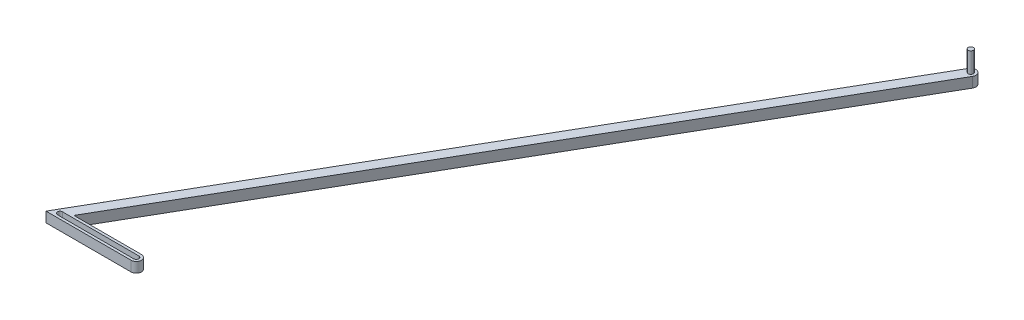
ISO-10303-21;
HEADER;
FILE_DESCRIPTION(('STEP AP214'),'2;1');
FILE_NAME('part.step','',(''),(''),'','','');
FILE_SCHEMA(('AUTOMOTIVE_DESIGN { 1 0 10303 214 1 1 1 1 }'));
ENDSEC;
DATA;
#1=APPLICATION_CONTEXT('core data for automotive mechanical design processes');
#2=APPLICATION_PROTOCOL_DEFINITION('international standard','automotive_design',2000,#1);
#3=PRODUCT_CONTEXT('',#1,'mechanical');
#4=PRODUCT('Part','Part','',(#3));
#5=PRODUCT_RELATED_PRODUCT_CATEGORY('part','',(#4));
#6=PRODUCT_DEFINITION_FORMATION('','',#4);
#7=PRODUCT_DEFINITION_CONTEXT('part definition',#1,'design');
#8=PRODUCT_DEFINITION('design','',#6,#7);
#9=PRODUCT_DEFINITION_SHAPE('','',#8);
#10=(LENGTH_UNIT() NAMED_UNIT(*) SI_UNIT(.MILLI.,.METRE.));
#11=(NAMED_UNIT(*) PLANE_ANGLE_UNIT() SI_UNIT($,.RADIAN.));
#12=(NAMED_UNIT(*) SI_UNIT($,.STERADIAN.) SOLID_ANGLE_UNIT());
#13=UNCERTAINTY_MEASURE_WITH_UNIT(LENGTH_MEASURE(1.E-05),#10,'distance_accuracy_value','');
#14=(GEOMETRIC_REPRESENTATION_CONTEXT(3) GLOBAL_UNCERTAINTY_ASSIGNED_CONTEXT((#13)) GLOBAL_UNIT_ASSIGNED_CONTEXT((#10,
#11,#12)) REPRESENTATION_CONTEXT('',''));
#15=CARTESIAN_POINT('',(0.,0.,0.));
#16=DIRECTION('',(0.,0.,1.));
#17=DIRECTION('',(1.,0.,0.));
#18=AXIS2_PLACEMENT_3D('',#15,#16,#17);
#19=CARTESIAN_POINT('',(-290.,-30.,632.19854476264));
#20=DIRECTION('',(0.,1.,0.));
#21=DIRECTION('',(0.,0.,1.));
#22=AXIS2_PLACEMENT_3D('',#19,#20,#21);
#23=CYLINDRICAL_SURFACE('',#22,2.49999999999995);
#24=CARTESIAN_POINT('',(-290.,-20.,632.19854476264));
#25=DIRECTION('',(0.,-1.,0.));
#26=DIRECTION('',(0.,0.,-1.));
#27=AXIS2_PLACEMENT_3D('',#24,#25,#26);
#28=CIRCLE('',#27,2.49999999999995);
#29=CARTESIAN_POINT('',(-290.,-20.,629.69854476264));
#30=VERTEX_POINT('',#29);
#31=CARTESIAN_POINT('',(-290.,-20.,634.69854476264));
#32=VERTEX_POINT('',#31);
#33=EDGE_CURVE('E169',#30,#32,#28,.T.);
#34=ORIENTED_EDGE('',*,*,#33,.F.);
#35=DIRECTION('',(0.,1.,0.));
#36=VECTOR('',#35,1.);
#37=CARTESIAN_POINT('',(-290.,-30.,629.69854476264));
#38=LINE('',#37,#36);
#39=CARTESIAN_POINT('',(-290.,-30.,629.69854476264));
#40=VERTEX_POINT('',#39);
#41=EDGE_CURVE('E12',#40,#30,#38,.T.);
#42=ORIENTED_EDGE('',*,*,#41,.F.);
#43=CARTESIAN_POINT('',(-290.,-30.,632.19854476264));
#44=DIRECTION('',(0.,-1.,0.));
#45=DIRECTION('',(0.,0.,-1.));
#46=AXIS2_PLACEMENT_3D('',#43,#44,#45);
#47=CIRCLE('',#46,2.49999999999995);
#48=CARTESIAN_POINT('',(-290.,-30.,634.69854476264));
#49=VERTEX_POINT('',#48);
#50=EDGE_CURVE('E143',#40,#49,#47,.T.);
#51=ORIENTED_EDGE('',*,*,#50,.T.);
#52=DIRECTION('',(0.,1.,0.));
#53=VECTOR('',#52,1.);
#54=CARTESIAN_POINT('',(-290.,-30.,634.69854476264));
#55=LINE('',#54,#53);
#56=EDGE_CURVE('E97',#49,#32,#55,.T.);
#57=ORIENTED_EDGE('',*,*,#56,.T.);
#58=EDGE_LOOP('',(#34,#42,#51,#57));
#59=FACE_BOUND('',#58,.T.);
#60=ADVANCED_FACE('F37',(#59),#23,.F.);
#61=CARTESIAN_POINT('',(0.,-30.,629.69854476264));
#62=DIRECTION('',(0.,0.,1.));
#63=DIRECTION('',(1.,0.,0.));
#64=AXIS2_PLACEMENT_3D('',#61,#62,#63);
#65=PLANE('',#64);
#66=DIRECTION('',(1.,0.,0.));
#67=VECTOR('',#66,1.);
#68=CARTESIAN_POINT('',(0.,-20.,629.69854476264));
#69=LINE('',#68,#67);
#70=CARTESIAN_POINT('',(-365.,-20.,629.69854476264));
#71=VERTEX_POINT('',#70);
#72=EDGE_CURVE('E133',#71,#30,#69,.T.);
#73=ORIENTED_EDGE('',*,*,#72,.F.);
#74=DIRECTION('',(0.,1.,0.));
#75=VECTOR('',#74,1.);
#76=CARTESIAN_POINT('',(-365.,-30.,629.69854476264));
#77=LINE('',#76,#75);
#78=CARTESIAN_POINT('',(-365.,-30.,629.69854476264));
#79=VERTEX_POINT('',#78);
#80=EDGE_CURVE('E47',#79,#71,#77,.T.);
#81=ORIENTED_EDGE('',*,*,#80,.F.);
#82=DIRECTION('',(1.,0.,0.));
#83=VECTOR('',#82,1.);
#84=CARTESIAN_POINT('',(0.,-30.,629.69854476264));
#85=LINE('',#84,#83);
#86=EDGE_CURVE('E131',#79,#40,#85,.T.);
#87=ORIENTED_EDGE('',*,*,#86,.T.);
#88=ORIENTED_EDGE('',*,*,#41,.T.);
#89=EDGE_LOOP('',(#73,#81,#87,#88));
#90=FACE_BOUND('',#89,.T.);
#91=ADVANCED_FACE('F129',(#90),#65,.T.);
#92=CARTESIAN_POINT('',(-365.,-30.,632.19854476264));
#93=DIRECTION('',(0.,1.,0.));
#94=DIRECTION('',(0.,0.,1.));
#95=AXIS2_PLACEMENT_3D('',#92,#93,#94);
#96=CYLINDRICAL_SURFACE('',#95,2.49999999999995);
#97=CARTESIAN_POINT('',(-365.,-20.,632.19854476264));
#98=DIRECTION('',(0.,-1.,0.));
#99=DIRECTION('',(0.,0.,-1.));
#100=AXIS2_PLACEMENT_3D('',#97,#98,#99);
#101=CIRCLE('',#100,2.49999999999995);
#102=CARTESIAN_POINT('',(-365.,-20.,634.69854476264));
#103=VERTEX_POINT('',#102);
#104=EDGE_CURVE('E172',#71,#103,#101,.F.);
#105=ORIENTED_EDGE('',*,*,#104,.T.);
#106=DIRECTION('',(0.,1.,0.));
#107=VECTOR('',#106,1.);
#108=CARTESIAN_POINT('',(-365.,-30.,634.69854476264));
#109=LINE('',#108,#107);
#110=CARTESIAN_POINT('',(-365.,-30.,634.69854476264));
#111=VERTEX_POINT('',#110);
#112=EDGE_CURVE('E136',#111,#103,#109,.T.);
#113=ORIENTED_EDGE('',*,*,#112,.F.);
#114=CARTESIAN_POINT('',(-365.,-30.,632.19854476264));
#115=DIRECTION('',(0.,-1.,0.));
#116=DIRECTION('',(0.,0.,-1.));
#117=AXIS2_PLACEMENT_3D('',#114,#115,#116);
#118=CIRCLE('',#117,2.49999999999995);
#119=EDGE_CURVE('E139',#79,#111,#118,.F.);
#120=ORIENTED_EDGE('',*,*,#119,.F.);
#121=ORIENTED_EDGE('',*,*,#80,.T.);
#122=EDGE_LOOP('',(#105,#113,#120,#121));
#123=FACE_BOUND('',#122,.T.);
#124=ADVANCED_FACE('F140',(#123),#96,.F.);
#125=CARTESIAN_POINT('',(-4.3301270189221,-30.,-2.49999999999995));
#126=DIRECTION('',(0.866025403784439,0.,0.5));
#127=DIRECTION('',(0.5,0.,-0.866025403784439));
#128=AXIS2_PLACEMENT_3D('',#125,#126,#127);
#129=PLANE('',#128);
#130=DIRECTION('',(0.5,0.,-0.866025403784439));
#131=VECTOR('',#130,1.);
#132=CARTESIAN_POINT('',(-4.3301270189221,-20.,-2.49999999999995));
#133=LINE('',#132,#131);
#134=CARTESIAN_POINT('',(-373.660254037844,-20.,637.19854476264));
#135=VERTEX_POINT('',#134);
#136=CARTESIAN_POINT('',(-41.8301270189222,-20.,62.4519052838332));
#137=VERTEX_POINT('',#136);
#138=EDGE_CURVE('E151',#135,#137,#133,.T.);
#139=ORIENTED_EDGE('',*,*,#138,.T.);
#140=DIRECTION('',(0.,1.,0.));
#141=VECTOR('',#140,1.);
#142=CARTESIAN_POINT('',(-41.8301270189222,-30.,62.4519052838332));
#143=LINE('',#142,#141);
#144=CARTESIAN_POINT('',(-41.8301270189222,-30.,62.4519052838332));
#145=VERTEX_POINT('',#144);
#146=EDGE_CURVE('E41',#145,#137,#143,.T.);
#147=ORIENTED_EDGE('',*,*,#146,.F.);
#148=DIRECTION('',(0.5,0.,-0.866025403784439));
#149=VECTOR('',#148,1.);
#150=CARTESIAN_POINT('',(-4.3301270189221,-30.,-2.49999999999995));
#151=LINE('',#150,#149);
#152=CARTESIAN_POINT('',(-373.660254037844,-30.,637.19854476264));
#153=VERTEX_POINT('',#152);
#154=EDGE_CURVE('E105',#153,#145,#151,.T.);
#155=ORIENTED_EDGE('',*,*,#154,.F.);
#156=DIRECTION('',(0.,1.,0.));
#157=VECTOR('',#156,1.);
#158=CARTESIAN_POINT('',(-373.660254037844,-30.,637.19854476264));
#159=LINE('',#158,#157);
#160=EDGE_CURVE('E150',#153,#135,#159,.T.);
#161=ORIENTED_EDGE('',*,*,#160,.T.);
#162=EDGE_LOOP('',(#139,#147,#155,#161));
#163=FACE_BOUND('',#162,.T.);
#164=ADVANCED_FACE('F39',(#163),#129,.F.);
#165=CARTESIAN_POINT('',(-37.5,-30.,64.9519052838332));
#166=DIRECTION('',(0.,1.,0.));
#167=DIRECTION('',(0.,0.,1.));
#168=AXIS2_PLACEMENT_3D('',#165,#166,#167);
#169=CYLINDRICAL_SURFACE('',#168,5.);
#170=CARTESIAN_POINT('',(-37.5,-20.,64.9519052838332));
#171=DIRECTION('',(0.,-1.,0.));
#172=DIRECTION('',(0.,0.,-1.));
#173=AXIS2_PLACEMENT_3D('',#170,#171,#172);
#174=CIRCLE('',#173,5.);
#175=CARTESIAN_POINT('',(-33.1698729810776,-20.,67.4519052838332));
#176=VERTEX_POINT('',#175);
#177=EDGE_CURVE('E154',#176,#137,#174,.F.);
#178=ORIENTED_EDGE('',*,*,#177,.F.);
#179=DIRECTION('',(0.,1.,0.));
#180=VECTOR('',#179,1.);
#181=CARTESIAN_POINT('',(-33.1698729810776,-30.,67.4519052838332));
#182=LINE('',#181,#180);
#183=CARTESIAN_POINT('',(-33.1698729810776,-30.,67.4519052838332));
#184=VERTEX_POINT('',#183);
#185=EDGE_CURVE('E184',#184,#176,#182,.T.);
#186=ORIENTED_EDGE('',*,*,#185,.F.);
#187=CARTESIAN_POINT('',(-37.5,-30.,64.9519052838332));
#188=DIRECTION('',(0.,-1.,0.));
#189=DIRECTION('',(0.,0.,-1.));
#190=AXIS2_PLACEMENT_3D('',#187,#188,#189);
#191=CIRCLE('',#190,5.);
#192=EDGE_CURVE('E192',#184,#145,#191,.F.);
#193=ORIENTED_EDGE('',*,*,#192,.T.);
#194=ORIENTED_EDGE('',*,*,#146,.T.);
#195=EDGE_LOOP('',(#178,#186,#193,#194));
#196=FACE_BOUND('',#195,.T.);
#197=ADVANCED_FACE('F191',(#196),#169,.T.);
#198=CARTESIAN_POINT('',(4.33012701892249,-30.,2.50000000000017));
#199=DIRECTION('',(0.866025403784438,0.,0.5));
#200=DIRECTION('',(0.5,0.,-0.866025403784439));
#201=AXIS2_PLACEMENT_3D('',#198,#199,#200);
#202=PLANE('',#201);
#203=DIRECTION('',(0.5,0.,-0.866025403784439));
#204=VECTOR('',#203,1.);
#205=CARTESIAN_POINT('',(4.33012701892249,-20.,2.50000000000017));
#206=LINE('',#205,#204);
#207=CARTESIAN_POINT('',(-356.339745962156,-20.,627.198544762641));
#208=VERTEX_POINT('',#207);
#209=EDGE_CURVE('E158',#208,#176,#206,.T.);
#210=ORIENTED_EDGE('',*,*,#209,.F.);
#211=DIRECTION('',(0.,1.,0.));
#212=VECTOR('',#211,1.);
#213=CARTESIAN_POINT('',(-356.339745962156,-30.,627.198544762641));
#214=LINE('',#213,#212);
#215=CARTESIAN_POINT('',(-356.339745962156,-30.,627.198544762641));
#216=VERTEX_POINT('',#215);
#217=EDGE_CURVE('E183',#216,#208,#214,.T.);
#218=ORIENTED_EDGE('',*,*,#217,.F.);
#219=DIRECTION('',(0.5,0.,-0.866025403784439));
#220=VECTOR('',#219,1.);
#221=CARTESIAN_POINT('',(4.33012701892249,-30.,2.50000000000017));
#222=LINE('',#221,#220);
#223=EDGE_CURVE('E203',#216,#184,#222,.T.);
#224=ORIENTED_EDGE('',*,*,#223,.T.);
#225=ORIENTED_EDGE('',*,*,#185,.T.);
#226=EDGE_LOOP('',(#210,#218,#224,#225));
#227=FACE_BOUND('',#226,.T.);
#228=ADVANCED_FACE('F200',(#227),#202,.T.);
#229=CARTESIAN_POINT('',(0.,-30.,627.19854476264));
#230=DIRECTION('',(0.,0.,1.));
#231=DIRECTION('',(1.,0.,0.));
#232=AXIS2_PLACEMENT_3D('',#229,#230,#231);
#233=PLANE('',#232);
#234=DIRECTION('',(1.,0.,0.));
#235=VECTOR('',#234,1.);
#236=CARTESIAN_POINT('',(0.,-20.,627.19854476264));
#237=LINE('',#236,#235);
#238=CARTESIAN_POINT('',(-290.,-20.,627.19854476264));
#239=VERTEX_POINT('',#238);
#240=EDGE_CURVE('E161',#208,#239,#237,.T.);
#241=ORIENTED_EDGE('',*,*,#240,.T.);
#242=DIRECTION('',(0.,1.,0.));
#243=VECTOR('',#242,1.);
#244=CARTESIAN_POINT('',(-290.,-30.,627.19854476264));
#245=LINE('',#244,#243);
#246=CARTESIAN_POINT('',(-290.,-30.,627.19854476264));
#247=VERTEX_POINT('',#246);
#248=EDGE_CURVE('E180',#247,#239,#245,.T.);
#249=ORIENTED_EDGE('',*,*,#248,.F.);
#250=DIRECTION('',(1.,0.,0.));
#251=VECTOR('',#250,1.);
#252=CARTESIAN_POINT('',(0.,-30.,627.19854476264));
#253=LINE('',#252,#251);
#254=EDGE_CURVE('E206',#216,#247,#253,.T.);
#255=ORIENTED_EDGE('',*,*,#254,.F.);
#256=ORIENTED_EDGE('',*,*,#217,.T.);
#257=EDGE_LOOP('',(#241,#249,#255,#256));
#258=FACE_BOUND('',#257,.T.);
#259=ADVANCED_FACE('F207',(#258),#233,.F.);
#260=CARTESIAN_POINT('',(-290.,-30.,632.19854476264));
#261=DIRECTION('',(0.,1.,0.));
#262=DIRECTION('',(0.,0.,1.));
#263=AXIS2_PLACEMENT_3D('',#260,#261,#262);
#264=CYLINDRICAL_SURFACE('',#263,5.);
#265=CARTESIAN_POINT('',(-290.,-20.,632.19854476264));
#266=DIRECTION('',(0.,-1.,0.));
#267=DIRECTION('',(0.,0.,-1.));
#268=AXIS2_PLACEMENT_3D('',#265,#266,#267);
#269=CIRCLE('',#268,5.);
#270=CARTESIAN_POINT('',(-290.,-20.,637.19854476264));
#271=VERTEX_POINT('',#270);
#272=EDGE_CURVE('E163',#239,#271,#269,.T.);
#273=ORIENTED_EDGE('',*,*,#272,.T.);
#274=DIRECTION('',(0.,1.,0.));
#275=VECTOR('',#274,1.);
#276=CARTESIAN_POINT('',(-290.,-30.,637.19854476264));
#277=LINE('',#276,#275);
#278=CARTESIAN_POINT('',(-290.,-30.,637.19854476264));
#279=VERTEX_POINT('',#278);
#280=EDGE_CURVE('E178',#279,#271,#277,.T.);
#281=ORIENTED_EDGE('',*,*,#280,.F.);
#282=CARTESIAN_POINT('',(-290.,-30.,632.19854476264));
#283=DIRECTION('',(0.,-1.,0.));
#284=DIRECTION('',(0.,0.,-1.));
#285=AXIS2_PLACEMENT_3D('',#282,#283,#284);
#286=CIRCLE('',#285,5.);
#287=EDGE_CURVE('E209',#247,#279,#286,.T.);
#288=ORIENTED_EDGE('',*,*,#287,.F.);
#289=ORIENTED_EDGE('',*,*,#248,.T.);
#290=EDGE_LOOP('',(#273,#281,#288,#289));
#291=FACE_BOUND('',#290,.T.);
#292=ADVANCED_FACE('F220',(#291),#264,.T.);
#293=CARTESIAN_POINT('',(0.,-30.,637.19854476264));
#294=DIRECTION('',(0.,0.,1.));
#295=DIRECTION('',(1.,0.,0.));
#296=AXIS2_PLACEMENT_3D('',#293,#294,#295);
#297=PLANE('',#296);
#298=DIRECTION('',(1.,0.,0.));
#299=VECTOR('',#298,1.);
#300=CARTESIAN_POINT('',(0.,-20.,637.19854476264));
#301=LINE('',#300,#299);
#302=EDGE_CURVE('E166',#135,#271,#301,.T.);
#303=ORIENTED_EDGE('',*,*,#302,.F.);
#304=ORIENTED_EDGE('',*,*,#160,.F.);
#305=DIRECTION('',(1.,0.,0.));
#306=VECTOR('',#305,1.);
#307=CARTESIAN_POINT('',(0.,-30.,637.19854476264));
#308=LINE('',#307,#306);
#309=EDGE_CURVE('E145',#153,#279,#308,.T.);
#310=ORIENTED_EDGE('',*,*,#309,.T.);
#311=ORIENTED_EDGE('',*,*,#280,.T.);
#312=EDGE_LOOP('',(#303,#304,#310,#311));
#313=FACE_BOUND('',#312,.T.);
#314=ADVANCED_FACE('F217',(#313),#297,.T.);
#315=CARTESIAN_POINT('',(0.,-30.,634.69854476264));
#316=DIRECTION('',(0.,0.,1.));
#317=DIRECTION('',(1.,0.,0.));
#318=AXIS2_PLACEMENT_3D('',#315,#316,#317);
#319=PLANE('',#318);
#320=DIRECTION('',(1.,0.,0.));
#321=VECTOR('',#320,1.);
#322=CARTESIAN_POINT('',(0.,-20.,634.69854476264));
#323=LINE('',#322,#321);
#324=EDGE_CURVE('E90',#103,#32,#323,.T.);
#325=ORIENTED_EDGE('',*,*,#324,.T.);
#326=ORIENTED_EDGE('',*,*,#56,.F.);
#327=DIRECTION('',(1.,0.,0.));
#328=VECTOR('',#327,1.);
#329=CARTESIAN_POINT('',(0.,-30.,634.69854476264));
#330=LINE('',#329,#328);
#331=EDGE_CURVE('E56',#111,#49,#330,.T.);
#332=ORIENTED_EDGE('',*,*,#331,.F.);
#333=ORIENTED_EDGE('',*,*,#112,.T.);
#334=EDGE_LOOP('',(#325,#326,#332,#333));
#335=FACE_BOUND('',#334,.T.);
#336=ADVANCED_FACE('F227',(#335),#319,.F.);
#337=CARTESIAN_POINT('',(0.,-30.,0.));
#338=DIRECTION('',(0.,-1.,0.));
#339=DIRECTION('',(0.,0.,-1.));
#340=AXIS2_PLACEMENT_3D('',#337,#338,#339);
#341=PLANE('',#340);
#342=ORIENTED_EDGE('',*,*,#154,.T.);
#343=ORIENTED_EDGE('',*,*,#192,.F.);
#344=ORIENTED_EDGE('',*,*,#223,.F.);
#345=ORIENTED_EDGE('',*,*,#254,.T.);
#346=ORIENTED_EDGE('',*,*,#287,.T.);
#347=ORIENTED_EDGE('',*,*,#309,.F.);
#348=EDGE_LOOP('',(#342,#343,#344,#345,#346,#347));
#349=FACE_BOUND('',#348,.T.);
#350=ORIENTED_EDGE('',*,*,#50,.F.);
#351=ORIENTED_EDGE('',*,*,#86,.F.);
#352=ORIENTED_EDGE('',*,*,#119,.T.);
#353=ORIENTED_EDGE('',*,*,#331,.T.);
#354=EDGE_LOOP('',(#350,#351,#352,#353));
#355=FACE_BOUND('',#354,.T.);
#356=ADVANCED_FACE('F142',(#349,#355),#341,.T.);
#357=CARTESIAN_POINT('',(0.,-20.,0.));
#358=DIRECTION('',(0.,-1.,0.));
#359=DIRECTION('',(0.,0.,-1.));
#360=AXIS2_PLACEMENT_3D('',#357,#358,#359);
#361=PLANE('',#360);
#362=CARTESIAN_POINT('',(-37.5,-20.,64.9519052838332));
#363=DIRECTION('',(0.,-1.,0.));
#364=DIRECTION('',(0.,0.,-1.));
#365=AXIS2_PLACEMENT_3D('',#362,#363,#364);
#366=CIRCLE('',#365,2.5);
#367=CARTESIAN_POINT('',(-37.5,-20.,62.4519052838332));
#368=VERTEX_POINT('',#367);
#369=EDGE_CURVE('E155',#368,#368,#366,.F.);
#370=ORIENTED_EDGE('',*,*,#369,.F.);
#371=EDGE_LOOP('',(#370));
#372=FACE_BOUND('',#371,.T.);
#373=ORIENTED_EDGE('',*,*,#138,.F.);
#374=ORIENTED_EDGE('',*,*,#302,.T.);
#375=ORIENTED_EDGE('',*,*,#272,.F.);
#376=ORIENTED_EDGE('',*,*,#240,.F.);
#377=ORIENTED_EDGE('',*,*,#209,.T.);
#378=ORIENTED_EDGE('',*,*,#177,.T.);
#379=EDGE_LOOP('',(#373,#374,#375,#376,#377,#378));
#380=FACE_BOUND('',#379,.T.);
#381=ORIENTED_EDGE('',*,*,#33,.T.);
#382=ORIENTED_EDGE('',*,*,#324,.F.);
#383=ORIENTED_EDGE('',*,*,#104,.F.);
#384=ORIENTED_EDGE('',*,*,#72,.T.);
#385=EDGE_LOOP('',(#381,#382,#383,#384));
#386=FACE_BOUND('',#385,.T.);
#387=ADVANCED_FACE('F197',(#372,#380,#386),#361,.F.);
#388=CARTESIAN_POINT('',(-37.5,-20.,64.9519052838332));
#389=DIRECTION('',(0.,1.,0.));
#390=DIRECTION('',(0.,0.,1.));
#391=AXIS2_PLACEMENT_3D('',#388,#389,#390);
#392=CYLINDRICAL_SURFACE('',#391,2.5);
#393=ORIENTED_EDGE('',*,*,#369,.T.);
#394=EDGE_LOOP('',(#393));
#395=FACE_BOUND('',#394,.T.);
#396=CARTESIAN_POINT('',(-37.5,0.,64.9519052838332));
#397=DIRECTION('',(0.,-1.,0.));
#398=DIRECTION('',(0.,0.,-1.));
#399=AXIS2_PLACEMENT_3D('',#396,#397,#398);
#400=CIRCLE('',#399,2.5);
#401=CARTESIAN_POINT('',(-37.5,0.,62.4519052838332));
#402=VERTEX_POINT('',#401);
#403=EDGE_CURVE('E258',#402,#402,#400,.F.);
#404=ORIENTED_EDGE('',*,*,#403,.F.);
#405=EDGE_LOOP('',(#404));
#406=FACE_BOUND('',#405,.T.);
#407=ADVANCED_FACE('F244',(#395,#406),#392,.T.);
#408=CARTESIAN_POINT('',(0.,0.,0.));
#409=DIRECTION('',(0.,-1.,0.));
#410=DIRECTION('',(0.,0.,-1.));
#411=AXIS2_PLACEMENT_3D('',#408,#409,#410);
#412=PLANE('',#411);
#413=ORIENTED_EDGE('',*,*,#403,.T.);
#414=EDGE_LOOP('',(#413));
#415=FACE_BOUND('',#414,.T.);
#416=ADVANCED_FACE('F250',(#415),#412,.F.);
#417=CLOSED_SHELL('',(#60,#91,#124,#164,#197,#228,#259,#292,#314,#336,#356,#387,#407,#416));
#418=MANIFOLD_SOLID_BREP('B2',#417);
#419=ADVANCED_BREP_SHAPE_REPRESENTATION('',(#18,#418),#14);
#420=SHAPE_DEFINITION_REPRESENTATION(#9,#419);
ENDSEC;
END-ISO-10303-21;
